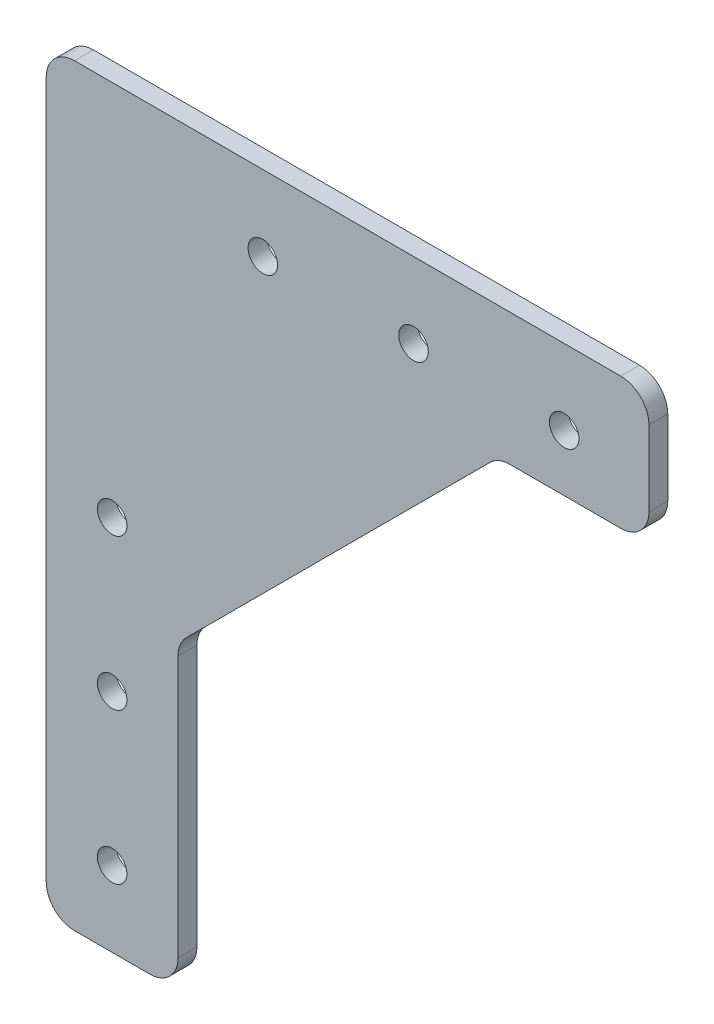
ISO-10303-21;
HEADER;
FILE_DESCRIPTION(('STEP AP214'),'2;1');
FILE_NAME('part.step','',(''),(''),'','','');
FILE_SCHEMA(('AUTOMOTIVE_DESIGN { 1 0 10303 214 1 1 1 1 }'));
ENDSEC;
DATA;
#1=APPLICATION_CONTEXT('core data for automotive mechanical design processes');
#2=APPLICATION_PROTOCOL_DEFINITION('international standard','automotive_design',2000,#1);
#3=PRODUCT_CONTEXT('',#1,'mechanical');
#4=PRODUCT('Part','Part','',(#3));
#5=PRODUCT_RELATED_PRODUCT_CATEGORY('part','',(#4));
#6=PRODUCT_DEFINITION_FORMATION('','',#4);
#7=PRODUCT_DEFINITION_CONTEXT('part definition',#1,'design');
#8=PRODUCT_DEFINITION('design','',#6,#7);
#9=PRODUCT_DEFINITION_SHAPE('','',#8);
#10=(LENGTH_UNIT() NAMED_UNIT(*) SI_UNIT(.MILLI.,.METRE.));
#11=(NAMED_UNIT(*) PLANE_ANGLE_UNIT() SI_UNIT($,.RADIAN.));
#12=(NAMED_UNIT(*) SI_UNIT($,.STERADIAN.) SOLID_ANGLE_UNIT());
#13=UNCERTAINTY_MEASURE_WITH_UNIT(LENGTH_MEASURE(1.E-05),#10,'distance_accuracy_value','');
#14=(GEOMETRIC_REPRESENTATION_CONTEXT(3) GLOBAL_UNCERTAINTY_ASSIGNED_CONTEXT((#13)) GLOBAL_UNIT_ASSIGNED_CONTEXT((#10,
#11,#12)) REPRESENTATION_CONTEXT('',''));
#15=CARTESIAN_POINT('',(0.,0.,0.));
#16=DIRECTION('',(0.,0.,1.));
#17=DIRECTION('',(1.,0.,0.));
#18=AXIS2_PLACEMENT_3D('',#15,#16,#17);
#19=CARTESIAN_POINT('',(0.,0.,1.5875));
#20=DIRECTION('',(0.,0.,-1.));
#21=DIRECTION('',(-1.,0.,0.));
#22=AXIS2_PLACEMENT_3D('',#19,#20,#21);
#23=PLANE('',#22);
#24=DIRECTION('',(0.,1.,0.));
#25=VECTOR('',#24,1.);
#26=CARTESIAN_POINT('',(0.,0.,1.5875));
#27=LINE('',#26,#25);
#28=CARTESIAN_POINT('',(0.,4.7625,1.5875));
#29=VERTEX_POINT('',#28);
#30=CARTESIAN_POINT('',(0.,122.2375,1.5875));
#31=VERTEX_POINT('',#30);
#32=EDGE_CURVE('E420',#29,#31,#27,.T.);
#33=ORIENTED_EDGE('',*,*,#32,.F.);
#34=CARTESIAN_POINT('',(4.7625,4.7625,1.5875));
#35=DIRECTION('',(0.,0.,-1.));
#36=DIRECTION('',(-1.,0.,0.));
#37=AXIS2_PLACEMENT_3D('',#34,#35,#36);
#38=CIRCLE('',#37,4.7625);
#39=CARTESIAN_POINT('',(4.7625,0.,1.5875));
#40=VERTEX_POINT('',#39);
#41=EDGE_CURVE('E337',#29,#40,#38,.F.);
#42=ORIENTED_EDGE('',*,*,#41,.T.);
#43=DIRECTION('',(-1.,0.,0.));
#44=VECTOR('',#43,1.);
#45=CARTESIAN_POINT('',(22.225,0.,1.5875));
#46=LINE('',#45,#44);
#47=CARTESIAN_POINT('',(17.4625,0.,1.5875));
#48=VERTEX_POINT('',#47);
#49=EDGE_CURVE('E374',#48,#40,#46,.T.);
#50=ORIENTED_EDGE('',*,*,#49,.F.);
#51=CARTESIAN_POINT('',(17.4625,4.7625,1.5875));
#52=DIRECTION('',(0.,0.,-1.));
#53=DIRECTION('',(-1.,0.,0.));
#54=AXIS2_PLACEMENT_3D('',#51,#52,#53);
#55=CIRCLE('',#54,4.7625);
#56=CARTESIAN_POINT('',(22.225,4.7625,1.5875));
#57=VERTEX_POINT('',#56);
#58=EDGE_CURVE('E310',#48,#57,#55,.F.);
#59=ORIENTED_EDGE('',*,*,#58,.T.);
#60=DIRECTION('',(0.,1.,0.));
#61=VECTOR('',#60,1.);
#62=CARTESIAN_POINT('',(22.225,0.,1.5875));
#63=LINE('',#62,#61);
#64=CARTESIAN_POINT('',(22.225,48.8273079091979,1.5875));
#65=VERTEX_POINT('',#64);
#66=EDGE_CURVE('E311',#57,#65,#63,.T.);
#67=ORIENTED_EDGE('',*,*,#66,.T.);
#68=CARTESIAN_POINT('',(26.9875,48.8273079091979,1.5875));
#69=DIRECTION('',(0.,0.,-1.));
#70=DIRECTION('',(-1.,0.,0.));
#71=AXIS2_PLACEMENT_3D('',#68,#69,#70);
#72=CIRCLE('',#71,4.7625);
#73=CARTESIAN_POINT('',(23.6199039545991,52.1949039545989,1.5875));
#74=VERTEX_POINT('',#73);
#75=EDGE_CURVE('E12',#65,#74,#72,.T.);
#76=ORIENTED_EDGE('',*,*,#75,.T.);
#77=DIRECTION('',(0.707106781186546,0.707106781186549,0.));
#78=VECTOR('',#77,1.);
#79=CARTESIAN_POINT('',(22.225,50.7999999999998,1.5875));
#80=LINE('',#79,#78);
#81=CARTESIAN_POINT('',(74.8050960454009,103.380096045401,1.5875));
#82=VERTEX_POINT('',#81);
#83=EDGE_CURVE('E315',#74,#82,#80,.T.);
#84=ORIENTED_EDGE('',*,*,#83,.T.);
#85=CARTESIAN_POINT('',(78.1726920908019,100.0125,1.5875));
#86=DIRECTION('',(0.,0.,-1.));
#87=DIRECTION('',(-1.,0.,0.));
#88=AXIS2_PLACEMENT_3D('',#85,#86,#87);
#89=CIRCLE('',#88,4.7625);
#90=CARTESIAN_POINT('',(78.1726920908019,104.775,1.5875));
#91=VERTEX_POINT('',#90);
#92=EDGE_CURVE('E364',#82,#91,#89,.T.);
#93=ORIENTED_EDGE('',*,*,#92,.T.);
#94=DIRECTION('',(1.,0.,0.));
#95=VECTOR('',#94,1.);
#96=CARTESIAN_POINT('',(76.2,104.775,1.5875));
#97=LINE('',#96,#95);
#98=CARTESIAN_POINT('',(96.8375,104.775,1.5875));
#99=VERTEX_POINT('',#98);
#100=EDGE_CURVE('E385',#91,#99,#97,.T.);
#101=ORIENTED_EDGE('',*,*,#100,.T.);
#102=CARTESIAN_POINT('',(96.8375,109.5375,1.5875));
#103=DIRECTION('',(0.,0.,-1.));
#104=DIRECTION('',(-1.,0.,0.));
#105=AXIS2_PLACEMENT_3D('',#102,#103,#104);
#106=CIRCLE('',#105,4.7625);
#107=CARTESIAN_POINT('',(101.6,109.5375,1.5875));
#108=VERTEX_POINT('',#107);
#109=EDGE_CURVE('E333',#99,#108,#106,.F.);
#110=ORIENTED_EDGE('',*,*,#109,.T.);
#111=DIRECTION('',(0.,-1.,0.));
#112=VECTOR('',#111,1.);
#113=CARTESIAN_POINT('',(101.6,127.,1.5875));
#114=LINE('',#113,#112);
#115=CARTESIAN_POINT('',(101.6,122.2375,1.5875));
#116=VERTEX_POINT('',#115);
#117=EDGE_CURVE('E388',#116,#108,#114,.T.);
#118=ORIENTED_EDGE('',*,*,#117,.F.);
#119=CARTESIAN_POINT('',(96.8375,122.2375,1.5875));
#120=DIRECTION('',(0.,0.,-1.));
#121=DIRECTION('',(-1.,0.,0.));
#122=AXIS2_PLACEMENT_3D('',#119,#120,#121);
#123=CIRCLE('',#122,4.7625);
#124=CARTESIAN_POINT('',(96.8375,127.,1.5875));
#125=VERTEX_POINT('',#124);
#126=EDGE_CURVE('E196',#116,#125,#123,.F.);
#127=ORIENTED_EDGE('',*,*,#126,.T.);
#128=DIRECTION('',(1.,0.,0.));
#129=VECTOR('',#128,1.);
#130=CARTESIAN_POINT('',(0.,127.,1.5875));
#131=LINE('',#130,#129);
#132=CARTESIAN_POINT('',(4.7625,127.,1.5875));
#133=VERTEX_POINT('',#132);
#134=EDGE_CURVE('E419',#133,#125,#131,.T.);
#135=ORIENTED_EDGE('',*,*,#134,.F.);
#136=CARTESIAN_POINT('',(4.7625,122.2375,1.5875));
#137=DIRECTION('',(0.,0.,-1.));
#138=DIRECTION('',(-1.,0.,0.));
#139=AXIS2_PLACEMENT_3D('',#136,#137,#138);
#140=CIRCLE('',#139,4.7625);
#141=EDGE_CURVE('E335',#133,#31,#140,.F.);
#142=ORIENTED_EDGE('',*,*,#141,.T.);
#143=EDGE_LOOP('',(#33,#42,#50,#59,#67,#76,#84,#93,#101,#110,#118,#127,#135,#142));
#144=FACE_BOUND('',#143,.T.);
#145=CARTESIAN_POINT('',(11.1124999999995,63.5,1.5875));
#146=DIRECTION('',(0.,0.,1.));
#147=DIRECTION('',(1.,0.,0.));
#148=AXIS2_PLACEMENT_3D('',#145,#146,#147);
#149=CIRCLE('',#148,2.48919999999999);
#150=CARTESIAN_POINT('',(13.6016999999995,63.5,1.5875));
#151=VERTEX_POINT('',#150);
#152=EDGE_CURVE('E306',#151,#151,#149,.T.);
#153=ORIENTED_EDGE('',*,*,#152,.F.);
#154=EDGE_LOOP('',(#153));
#155=FACE_BOUND('',#154,.T.);
#156=CARTESIAN_POINT('',(11.1125,12.7,1.5875));
#157=DIRECTION('',(0.,0.,1.));
#158=DIRECTION('',(1.,0.,0.));
#159=AXIS2_PLACEMENT_3D('',#156,#157,#158);
#160=CIRCLE('',#159,2.4892);
#161=CARTESIAN_POINT('',(13.6017,12.7,1.5875));
#162=VERTEX_POINT('',#161);
#163=EDGE_CURVE('E429',#162,#162,#160,.T.);
#164=ORIENTED_EDGE('',*,*,#163,.F.);
#165=EDGE_LOOP('',(#164));
#166=FACE_BOUND('',#165,.T.);
#167=CARTESIAN_POINT('',(87.3125,114.3,1.5875));
#168=DIRECTION('',(0.,0.,1.));
#169=DIRECTION('',(1.,0.,0.));
#170=AXIS2_PLACEMENT_3D('',#167,#168,#169);
#171=CIRCLE('',#170,2.48920000000001);
#172=CARTESIAN_POINT('',(89.8017,114.3,1.5875));
#173=VERTEX_POINT('',#172);
#174=EDGE_CURVE('E435',#173,#173,#171,.T.);
#175=ORIENTED_EDGE('',*,*,#174,.F.);
#176=EDGE_LOOP('',(#175));
#177=FACE_BOUND('',#176,.T.);
#178=CARTESIAN_POINT('',(11.1124999999997,38.1,1.5875));
#179=DIRECTION('',(0.,0.,1.));
#180=DIRECTION('',(1.,0.,0.));
#181=AXIS2_PLACEMENT_3D('',#178,#179,#180);
#182=CIRCLE('',#181,2.4892);
#183=CARTESIAN_POINT('',(13.6016999999997,38.1,1.5875));
#184=VERTEX_POINT('',#183);
#185=EDGE_CURVE('E441',#184,#184,#182,.T.);
#186=ORIENTED_EDGE('',*,*,#185,.F.);
#187=EDGE_LOOP('',(#186));
#188=FACE_BOUND('',#187,.T.);
#189=CARTESIAN_POINT('',(61.9125,114.3,1.5875));
#190=DIRECTION('',(0.,0.,1.));
#191=DIRECTION('',(1.,0.,0.));
#192=AXIS2_PLACEMENT_3D('',#189,#190,#191);
#193=CIRCLE('',#192,2.4892);
#194=CARTESIAN_POINT('',(64.4017,114.3,1.5875));
#195=VERTEX_POINT('',#194);
#196=EDGE_CURVE('E447',#195,#195,#193,.T.);
#197=ORIENTED_EDGE('',*,*,#196,.F.);
#198=EDGE_LOOP('',(#197));
#199=FACE_BOUND('',#198,.T.);
#200=CARTESIAN_POINT('',(36.5125,114.3,1.5875));
#201=DIRECTION('',(0.,0.,1.));
#202=DIRECTION('',(1.,0.,0.));
#203=AXIS2_PLACEMENT_3D('',#200,#201,#202);
#204=CIRCLE('',#203,2.4892);
#205=CARTESIAN_POINT('',(39.0017,114.3,1.5875));
#206=VERTEX_POINT('',#205);
#207=EDGE_CURVE('E453',#206,#206,#204,.T.);
#208=ORIENTED_EDGE('',*,*,#207,.F.);
#209=EDGE_LOOP('',(#208));
#210=FACE_BOUND('',#209,.T.);
#211=ADVANCED_FACE('F181',(#144,#155,#166,#177,#188,#199,#210),#23,.F.);
#212=CARTESIAN_POINT('',(0.,0.,-1.5875));
#213=DIRECTION('',(0.,0.,-1.));
#214=DIRECTION('',(-1.,0.,0.));
#215=AXIS2_PLACEMENT_3D('',#212,#213,#214);
#216=PLANE('',#215);
#217=CARTESIAN_POINT('',(61.9125,114.3,-1.5875));
#218=DIRECTION('',(0.,0.,1.));
#219=DIRECTION('',(1.,0.,0.));
#220=AXIS2_PLACEMENT_3D('',#217,#218,#219);
#221=CIRCLE('',#220,2.4892);
#222=CARTESIAN_POINT('',(64.4017,114.3,-1.5875));
#223=VERTEX_POINT('',#222);
#224=EDGE_CURVE('E450',#223,#223,#221,.T.);
#225=ORIENTED_EDGE('',*,*,#224,.T.);
#226=EDGE_LOOP('',(#225));
#227=FACE_BOUND('',#226,.T.);
#228=CARTESIAN_POINT('',(87.3125,114.3,-1.5875));
#229=DIRECTION('',(0.,0.,1.));
#230=DIRECTION('',(1.,0.,0.));
#231=AXIS2_PLACEMENT_3D('',#228,#229,#230);
#232=CIRCLE('',#231,2.48920000000001);
#233=CARTESIAN_POINT('',(89.8017,114.3,-1.5875));
#234=VERTEX_POINT('',#233);
#235=EDGE_CURVE('E438',#234,#234,#232,.T.);
#236=ORIENTED_EDGE('',*,*,#235,.T.);
#237=EDGE_LOOP('',(#236));
#238=FACE_BOUND('',#237,.T.);
#239=CARTESIAN_POINT('',(11.1124999999995,63.5,-1.5875));
#240=DIRECTION('',(0.,0.,1.));
#241=DIRECTION('',(1.,0.,0.));
#242=AXIS2_PLACEMENT_3D('',#239,#240,#241);
#243=CIRCLE('',#242,2.48919999999999);
#244=CARTESIAN_POINT('',(13.6016999999995,63.5,-1.5875));
#245=VERTEX_POINT('',#244);
#246=EDGE_CURVE('E426',#245,#245,#243,.T.);
#247=ORIENTED_EDGE('',*,*,#246,.T.);
#248=EDGE_LOOP('',(#247));
#249=FACE_BOUND('',#248,.T.);
#250=DIRECTION('',(-1.,0.,0.));
#251=VECTOR('',#250,1.);
#252=CARTESIAN_POINT('',(22.225,0.,-1.5875));
#253=LINE('',#252,#251);
#254=CARTESIAN_POINT('',(17.4625,0.,-1.5875));
#255=VERTEX_POINT('',#254);
#256=CARTESIAN_POINT('',(4.7625,0.,-1.5875));
#257=VERTEX_POINT('',#256);
#258=EDGE_CURVE('E287',#255,#257,#253,.T.);
#259=ORIENTED_EDGE('',*,*,#258,.T.);
#260=CARTESIAN_POINT('',(4.7625,4.7625,-1.5875));
#261=DIRECTION('',(0.,0.,-1.));
#262=DIRECTION('',(-1.,0.,0.));
#263=AXIS2_PLACEMENT_3D('',#260,#261,#262);
#264=CIRCLE('',#263,4.7625);
#265=CARTESIAN_POINT('',(0.,4.7625,-1.5875));
#266=VERTEX_POINT('',#265);
#267=EDGE_CURVE('E324',#257,#266,#264,.T.);
#268=ORIENTED_EDGE('',*,*,#267,.T.);
#269=DIRECTION('',(0.,1.,0.));
#270=VECTOR('',#269,1.);
#271=CARTESIAN_POINT('',(0.,0.,-1.5875));
#272=LINE('',#271,#270);
#273=CARTESIAN_POINT('',(0.,122.2375,-1.5875));
#274=VERTEX_POINT('',#273);
#275=EDGE_CURVE('E305',#266,#274,#272,.T.);
#276=ORIENTED_EDGE('',*,*,#275,.T.);
#277=CARTESIAN_POINT('',(4.7625,122.2375,-1.5875));
#278=DIRECTION('',(0.,0.,-1.));
#279=DIRECTION('',(-1.,0.,0.));
#280=AXIS2_PLACEMENT_3D('',#277,#278,#279);
#281=CIRCLE('',#280,4.7625);
#282=CARTESIAN_POINT('',(4.7625,127.,-1.5875));
#283=VERTEX_POINT('',#282);
#284=EDGE_CURVE('E322',#274,#283,#281,.T.);
#285=ORIENTED_EDGE('',*,*,#284,.T.);
#286=DIRECTION('',(1.,0.,0.));
#287=VECTOR('',#286,1.);
#288=CARTESIAN_POINT('',(0.,127.,-1.5875));
#289=LINE('',#288,#287);
#290=CARTESIAN_POINT('',(96.8375,127.,-1.5875));
#291=VERTEX_POINT('',#290);
#292=EDGE_CURVE('E394',#283,#291,#289,.T.);
#293=ORIENTED_EDGE('',*,*,#292,.T.);
#294=CARTESIAN_POINT('',(96.8375,122.2375,-1.5875));
#295=DIRECTION('',(0.,0.,-1.));
#296=DIRECTION('',(-1.,0.,0.));
#297=AXIS2_PLACEMENT_3D('',#294,#295,#296);
#298=CIRCLE('',#297,4.7625);
#299=CARTESIAN_POINT('',(101.6,122.2375,-1.5875));
#300=VERTEX_POINT('',#299);
#301=EDGE_CURVE('E295',#291,#300,#298,.T.);
#302=ORIENTED_EDGE('',*,*,#301,.T.);
#303=DIRECTION('',(0.,-1.,0.));
#304=VECTOR('',#303,1.);
#305=CARTESIAN_POINT('',(101.6,127.,-1.5875));
#306=LINE('',#305,#304);
#307=CARTESIAN_POINT('',(101.6,109.5375,-1.5875));
#308=VERTEX_POINT('',#307);
#309=EDGE_CURVE('E397',#300,#308,#306,.T.);
#310=ORIENTED_EDGE('',*,*,#309,.T.);
#311=CARTESIAN_POINT('',(96.8375,109.5375,-1.5875));
#312=DIRECTION('',(0.,0.,-1.));
#313=DIRECTION('',(-1.,0.,0.));
#314=AXIS2_PLACEMENT_3D('',#311,#312,#313);
#315=CIRCLE('',#314,4.7625);
#316=CARTESIAN_POINT('',(96.8375,104.775,-1.5875));
#317=VERTEX_POINT('',#316);
#318=EDGE_CURVE('E294',#308,#317,#315,.T.);
#319=ORIENTED_EDGE('',*,*,#318,.T.);
#320=DIRECTION('',(1.,0.,0.));
#321=VECTOR('',#320,1.);
#322=CARTESIAN_POINT('',(76.2,104.775,-1.5875));
#323=LINE('',#322,#321);
#324=CARTESIAN_POINT('',(78.1726920908019,104.775,-1.5875));
#325=VERTEX_POINT('',#324);
#326=EDGE_CURVE('E400',#325,#317,#323,.T.);
#327=ORIENTED_EDGE('',*,*,#326,.F.);
#328=CARTESIAN_POINT('',(78.1726920908019,100.0125,-1.5875));
#329=DIRECTION('',(0.,0.,-1.));
#330=DIRECTION('',(-1.,0.,0.));
#331=AXIS2_PLACEMENT_3D('',#328,#329,#330);
#332=CIRCLE('',#331,4.7625);
#333=CARTESIAN_POINT('',(74.8050960454009,103.380096045401,-1.5875));
#334=VERTEX_POINT('',#333);
#335=EDGE_CURVE('E362',#325,#334,#332,.F.);
#336=ORIENTED_EDGE('',*,*,#335,.T.);
#337=DIRECTION('',(0.707106781186546,0.707106781186549,0.));
#338=VECTOR('',#337,1.);
#339=CARTESIAN_POINT('',(22.225,50.7999999999998,-1.5875));
#340=LINE('',#339,#338);
#341=CARTESIAN_POINT('',(23.6199039545991,52.1949039545989,-1.5875));
#342=VERTEX_POINT('',#341);
#343=EDGE_CURVE('E367',#342,#334,#340,.T.);
#344=ORIENTED_EDGE('',*,*,#343,.F.);
#345=CARTESIAN_POINT('',(26.9875,48.8273079091979,-1.5875));
#346=DIRECTION('',(0.,0.,-1.));
#347=DIRECTION('',(-1.,0.,0.));
#348=AXIS2_PLACEMENT_3D('',#345,#346,#347);
#349=CIRCLE('',#348,4.7625);
#350=CARTESIAN_POINT('',(22.225,48.8273079091979,-1.5875));
#351=VERTEX_POINT('',#350);
#352=EDGE_CURVE('E189',#342,#351,#349,.F.);
#353=ORIENTED_EDGE('',*,*,#352,.T.);
#354=DIRECTION('',(0.,1.,0.));
#355=VECTOR('',#354,1.);
#356=CARTESIAN_POINT('',(22.225,0.,-1.5875));
#357=LINE('',#356,#355);
#358=CARTESIAN_POINT('',(22.225,4.7625,-1.5875));
#359=VERTEX_POINT('',#358);
#360=EDGE_CURVE('E289',#359,#351,#357,.T.);
#361=ORIENTED_EDGE('',*,*,#360,.F.);
#362=CARTESIAN_POINT('',(17.4625,4.7625,-1.5875));
#363=DIRECTION('',(0.,0.,-1.));
#364=DIRECTION('',(-1.,0.,0.));
#365=AXIS2_PLACEMENT_3D('',#362,#363,#364);
#366=CIRCLE('',#365,4.7625);
#367=EDGE_CURVE('E283',#359,#255,#366,.T.);
#368=ORIENTED_EDGE('',*,*,#367,.T.);
#369=EDGE_LOOP('',(#259,#268,#276,#285,#293,#302,#310,#319,#327,#336,#344,#353,#361,#368));
#370=FACE_BOUND('',#369,.T.);
#371=CARTESIAN_POINT('',(11.1125,12.7,-1.5875));
#372=DIRECTION('',(0.,0.,1.));
#373=DIRECTION('',(1.,0.,0.));
#374=AXIS2_PLACEMENT_3D('',#371,#372,#373);
#375=CIRCLE('',#374,2.4892);
#376=CARTESIAN_POINT('',(13.6017,12.7,-1.5875));
#377=VERTEX_POINT('',#376);
#378=EDGE_CURVE('E432',#377,#377,#375,.T.);
#379=ORIENTED_EDGE('',*,*,#378,.T.);
#380=EDGE_LOOP('',(#379));
#381=FACE_BOUND('',#380,.T.);
#382=CARTESIAN_POINT('',(11.1124999999997,38.1,-1.5875));
#383=DIRECTION('',(0.,0.,1.));
#384=DIRECTION('',(1.,0.,0.));
#385=AXIS2_PLACEMENT_3D('',#382,#383,#384);
#386=CIRCLE('',#385,2.4892);
#387=CARTESIAN_POINT('',(13.6016999999997,38.1,-1.5875));
#388=VERTEX_POINT('',#387);
#389=EDGE_CURVE('E444',#388,#388,#386,.T.);
#390=ORIENTED_EDGE('',*,*,#389,.T.);
#391=EDGE_LOOP('',(#390));
#392=FACE_BOUND('',#391,.T.);
#393=CARTESIAN_POINT('',(36.5125,114.3,-1.5875));
#394=DIRECTION('',(0.,0.,1.));
#395=DIRECTION('',(1.,0.,0.));
#396=AXIS2_PLACEMENT_3D('',#393,#394,#395);
#397=CIRCLE('',#396,2.4892);
#398=CARTESIAN_POINT('',(39.0017,114.3,-1.5875));
#399=VERTEX_POINT('',#398);
#400=EDGE_CURVE('E456',#399,#399,#397,.T.);
#401=ORIENTED_EDGE('',*,*,#400,.T.);
#402=EDGE_LOOP('',(#401));
#403=FACE_BOUND('',#402,.T.);
#404=ADVANCED_FACE('F285',(#227,#238,#249,#370,#381,#392,#403),#216,.T.);
#405=CARTESIAN_POINT('',(22.225,0.,1.5875));
#406=DIRECTION('',(0.,-1.,0.));
#407=DIRECTION('',(0.,0.,-1.));
#408=AXIS2_PLACEMENT_3D('',#405,#406,#407);
#409=PLANE('',#408);
#410=ORIENTED_EDGE('',*,*,#49,.T.);
#411=DIRECTION('',(0.,0.,-1.));
#412=VECTOR('',#411,1.);
#413=CARTESIAN_POINT('',(4.7625,0.,1.5875));
#414=LINE('',#413,#412);
#415=EDGE_CURVE('E304',#40,#257,#414,.T.);
#416=ORIENTED_EDGE('',*,*,#415,.T.);
#417=ORIENTED_EDGE('',*,*,#258,.F.);
#418=DIRECTION('',(0.,0.,-1.));
#419=VECTOR('',#418,1.);
#420=CARTESIAN_POINT('',(17.4625,0.,1.5875));
#421=LINE('',#420,#419);
#422=EDGE_CURVE('E301',#255,#48,#421,.F.);
#423=ORIENTED_EDGE('',*,*,#422,.T.);
#424=EDGE_LOOP('',(#410,#416,#417,#423));
#425=FACE_BOUND('',#424,.T.);
#426=ADVANCED_FACE('F300',(#425),#409,.T.);
#427=CARTESIAN_POINT('',(22.225,0.,1.5875));
#428=DIRECTION('',(-1.,0.,0.));
#429=DIRECTION('',(0.,0.,1.));
#430=AXIS2_PLACEMENT_3D('',#427,#428,#429);
#431=PLANE('',#430);
#432=ORIENTED_EDGE('',*,*,#360,.T.);
#433=DIRECTION('',(0.,0.,-1.));
#434=VECTOR('',#433,1.);
#435=CARTESIAN_POINT('',(22.225,48.8273079091979,1.5875));
#436=LINE('',#435,#434);
#437=EDGE_CURVE('E360',#351,#65,#436,.F.);
#438=ORIENTED_EDGE('',*,*,#437,.T.);
#439=ORIENTED_EDGE('',*,*,#66,.F.);
#440=DIRECTION('',(0.,0.,-1.));
#441=VECTOR('',#440,1.);
#442=CARTESIAN_POINT('',(22.225,4.7625,-1.5875));
#443=LINE('',#442,#441);
#444=EDGE_CURVE('E358',#57,#359,#443,.T.);
#445=ORIENTED_EDGE('',*,*,#444,.T.);
#446=EDGE_LOOP('',(#432,#438,#439,#445));
#447=FACE_BOUND('',#446,.T.);
#448=ADVANCED_FACE('F372',(#447),#431,.F.);
#449=CARTESIAN_POINT('',(22.225,50.7999999999998,1.5875));
#450=DIRECTION('',(-0.707106781186549,0.707106781186546,0.));
#451=DIRECTION('',(-0.707106781186546,-0.707106781186549,0.));
#452=AXIS2_PLACEMENT_3D('',#449,#450,#451);
#453=PLANE('',#452);
#454=ORIENTED_EDGE('',*,*,#343,.T.);
#455=DIRECTION('',(0.,0.,-1.));
#456=VECTOR('',#455,1.);
#457=CARTESIAN_POINT('',(74.8050960454009,103.380096045401,1.5875));
#458=LINE('',#457,#456);
#459=EDGE_CURVE('E356',#334,#82,#458,.F.);
#460=ORIENTED_EDGE('',*,*,#459,.T.);
#461=ORIENTED_EDGE('',*,*,#83,.F.);
#462=DIRECTION('',(0.,0.,-1.));
#463=VECTOR('',#462,1.);
#464=CARTESIAN_POINT('',(23.6199039545991,52.1949039545989,-1.5875));
#465=LINE('',#464,#463);
#466=EDGE_CURVE('E353',#74,#342,#465,.T.);
#467=ORIENTED_EDGE('',*,*,#466,.T.);
#468=EDGE_LOOP('',(#454,#460,#461,#467));
#469=FACE_BOUND('',#468,.T.);
#470=ADVANCED_FACE('F383',(#469),#453,.F.);
#471=CARTESIAN_POINT('',(76.2,104.775,1.5875));
#472=DIRECTION('',(0.,1.,0.));
#473=DIRECTION('',(0.,0.,1.));
#474=AXIS2_PLACEMENT_3D('',#471,#472,#473);
#475=PLANE('',#474);
#476=ORIENTED_EDGE('',*,*,#326,.T.);
#477=DIRECTION('',(0.,0.,-1.));
#478=VECTOR('',#477,1.);
#479=CARTESIAN_POINT('',(96.8375,104.775,1.5875));
#480=LINE('',#479,#478);
#481=EDGE_CURVE('E351',#317,#99,#480,.F.);
#482=ORIENTED_EDGE('',*,*,#481,.T.);
#483=ORIENTED_EDGE('',*,*,#100,.F.);
#484=DIRECTION('',(0.,0.,-1.));
#485=VECTOR('',#484,1.);
#486=CARTESIAN_POINT('',(78.1726920908019,104.775,-1.5875));
#487=LINE('',#486,#485);
#488=EDGE_CURVE('E348',#91,#325,#487,.T.);
#489=ORIENTED_EDGE('',*,*,#488,.T.);
#490=EDGE_LOOP('',(#476,#482,#483,#489));
#491=FACE_BOUND('',#490,.T.);
#492=ADVANCED_FACE('F408',(#491),#475,.F.);
#493=CARTESIAN_POINT('',(101.6,127.,1.5875));
#494=DIRECTION('',(1.,0.,0.));
#495=DIRECTION('',(0.,0.,-1.));
#496=AXIS2_PLACEMENT_3D('',#493,#494,#495);
#497=PLANE('',#496);
#498=ORIENTED_EDGE('',*,*,#117,.T.);
#499=DIRECTION('',(0.,0.,-1.));
#500=VECTOR('',#499,1.);
#501=CARTESIAN_POINT('',(101.6,109.5375,-1.5875));
#502=LINE('',#501,#500);
#503=EDGE_CURVE('E345',#108,#308,#502,.T.);
#504=ORIENTED_EDGE('',*,*,#503,.T.);
#505=ORIENTED_EDGE('',*,*,#309,.F.);
#506=DIRECTION('',(0.,0.,-1.));
#507=VECTOR('',#506,1.);
#508=CARTESIAN_POINT('',(101.6,122.2375,1.5875));
#509=LINE('',#508,#507);
#510=EDGE_CURVE('E343',#300,#116,#509,.F.);
#511=ORIENTED_EDGE('',*,*,#510,.T.);
#512=EDGE_LOOP('',(#498,#504,#505,#511));
#513=FACE_BOUND('',#512,.T.);
#514=ADVANCED_FACE('F416',(#513),#497,.T.);
#515=CARTESIAN_POINT('',(0.,127.,1.5875));
#516=DIRECTION('',(0.,1.,0.));
#517=DIRECTION('',(0.,0.,1.));
#518=AXIS2_PLACEMENT_3D('',#515,#516,#517);
#519=PLANE('',#518);
#520=ORIENTED_EDGE('',*,*,#292,.F.);
#521=DIRECTION('',(0.,0.,-1.));
#522=VECTOR('',#521,1.);
#523=CARTESIAN_POINT('',(4.7625,127.,1.5875));
#524=LINE('',#523,#522);
#525=EDGE_CURVE('E203',#283,#133,#524,.F.);
#526=ORIENTED_EDGE('',*,*,#525,.T.);
#527=ORIENTED_EDGE('',*,*,#134,.T.);
#528=DIRECTION('',(0.,0.,-1.));
#529=VECTOR('',#528,1.);
#530=CARTESIAN_POINT('',(96.8375,127.,1.5875));
#531=LINE('',#530,#529);
#532=EDGE_CURVE('E339',#125,#291,#531,.T.);
#533=ORIENTED_EDGE('',*,*,#532,.T.);
#534=EDGE_LOOP('',(#520,#526,#527,#533));
#535=FACE_BOUND('',#534,.T.);
#536=ADVANCED_FACE('F484',(#535),#519,.T.);
#537=CARTESIAN_POINT('',(0.,0.,1.5875));
#538=DIRECTION('',(-1.,0.,0.));
#539=DIRECTION('',(0.,0.,1.));
#540=AXIS2_PLACEMENT_3D('',#537,#538,#539);
#541=PLANE('',#540);
#542=ORIENTED_EDGE('',*,*,#275,.F.);
#543=DIRECTION('',(0.,0.,-1.));
#544=VECTOR('',#543,1.);
#545=CARTESIAN_POINT('',(0.,4.7625,1.5875));
#546=LINE('',#545,#544);
#547=EDGE_CURVE('E329',#266,#29,#546,.F.);
#548=ORIENTED_EDGE('',*,*,#547,.T.);
#549=ORIENTED_EDGE('',*,*,#32,.T.);
#550=DIRECTION('',(0.,0.,-1.));
#551=VECTOR('',#550,1.);
#552=CARTESIAN_POINT('',(0.,122.2375,1.5875));
#553=LINE('',#552,#551);
#554=EDGE_CURVE('E326',#31,#274,#553,.T.);
#555=ORIENTED_EDGE('',*,*,#554,.T.);
#556=EDGE_LOOP('',(#542,#548,#549,#555));
#557=FACE_BOUND('',#556,.T.);
#558=ADVANCED_FACE('F487',(#557),#541,.T.);
#559=CARTESIAN_POINT('',(11.1124999999995,63.5,1.5875));
#560=DIRECTION('',(0.,0.,-1.));
#561=DIRECTION('',(-1.,0.,0.));
#562=AXIS2_PLACEMENT_3D('',#559,#560,#561);
#563=CYLINDRICAL_SURFACE('',#562,2.48919999999999);
#564=ORIENTED_EDGE('',*,*,#152,.T.);
#565=EDGE_LOOP('',(#564));
#566=FACE_BOUND('',#565,.T.);
#567=ORIENTED_EDGE('',*,*,#246,.F.);
#568=EDGE_LOOP('',(#567));
#569=FACE_BOUND('',#568,.T.);
#570=ADVANCED_FACE('F473',(#566,#569),#563,.F.);
#571=CARTESIAN_POINT('',(11.1125,12.7,1.5875));
#572=DIRECTION('',(0.,0.,-1.));
#573=DIRECTION('',(-1.,0.,0.));
#574=AXIS2_PLACEMENT_3D('',#571,#572,#573);
#575=CYLINDRICAL_SURFACE('',#574,2.4892);
#576=ORIENTED_EDGE('',*,*,#163,.T.);
#577=EDGE_LOOP('',(#576));
#578=FACE_BOUND('',#577,.T.);
#579=ORIENTED_EDGE('',*,*,#378,.F.);
#580=EDGE_LOOP('',(#579));
#581=FACE_BOUND('',#580,.T.);
#582=ADVANCED_FACE('F665',(#578,#581),#575,.F.);
#583=CARTESIAN_POINT('',(87.3125,114.3,1.5875));
#584=DIRECTION('',(0.,0.,-1.));
#585=DIRECTION('',(-1.,0.,0.));
#586=AXIS2_PLACEMENT_3D('',#583,#584,#585);
#587=CYLINDRICAL_SURFACE('',#586,2.48920000000001);
#588=ORIENTED_EDGE('',*,*,#174,.T.);
#589=EDGE_LOOP('',(#588));
#590=FACE_BOUND('',#589,.T.);
#591=ORIENTED_EDGE('',*,*,#235,.F.);
#592=EDGE_LOOP('',(#591));
#593=FACE_BOUND('',#592,.T.);
#594=ADVANCED_FACE('F654',(#590,#593),#587,.F.);
#595=CARTESIAN_POINT('',(11.1124999999997,38.1,1.5875));
#596=DIRECTION('',(0.,0.,-1.));
#597=DIRECTION('',(-1.,0.,0.));
#598=AXIS2_PLACEMENT_3D('',#595,#596,#597);
#599=CYLINDRICAL_SURFACE('',#598,2.4892);
#600=ORIENTED_EDGE('',*,*,#185,.T.);
#601=EDGE_LOOP('',(#600));
#602=FACE_BOUND('',#601,.T.);
#603=ORIENTED_EDGE('',*,*,#389,.F.);
#604=EDGE_LOOP('',(#603));
#605=FACE_BOUND('',#604,.T.);
#606=ADVANCED_FACE('F643',(#602,#605),#599,.F.);
#607=CARTESIAN_POINT('',(61.9125,114.3,1.5875));
#608=DIRECTION('',(0.,0.,-1.));
#609=DIRECTION('',(-1.,0.,0.));
#610=AXIS2_PLACEMENT_3D('',#607,#608,#609);
#611=CYLINDRICAL_SURFACE('',#610,2.4892);
#612=ORIENTED_EDGE('',*,*,#196,.T.);
#613=EDGE_LOOP('',(#612));
#614=FACE_BOUND('',#613,.T.);
#615=ORIENTED_EDGE('',*,*,#224,.F.);
#616=EDGE_LOOP('',(#615));
#617=FACE_BOUND('',#616,.T.);
#618=ADVANCED_FACE('F633',(#614,#617),#611,.F.);
#619=CARTESIAN_POINT('',(36.5125,114.3,1.5875));
#620=DIRECTION('',(0.,0.,-1.));
#621=DIRECTION('',(-1.,0.,0.));
#622=AXIS2_PLACEMENT_3D('',#619,#620,#621);
#623=CYLINDRICAL_SURFACE('',#622,2.4892);
#624=ORIENTED_EDGE('',*,*,#207,.T.);
#625=EDGE_LOOP('',(#624));
#626=FACE_BOUND('',#625,.T.);
#627=ORIENTED_EDGE('',*,*,#400,.F.);
#628=EDGE_LOOP('',(#627));
#629=FACE_BOUND('',#628,.T.);
#630=ADVANCED_FACE('F462',(#626,#629),#623,.F.);
#631=CARTESIAN_POINT('',(4.7625,4.7625,1.5875));
#632=DIRECTION('',(0.,0.,-1.));
#633=DIRECTION('',(-1.,0.,0.));
#634=AXIS2_PLACEMENT_3D('',#631,#632,#633);
#635=CYLINDRICAL_SURFACE('',#634,4.7625);
#636=ORIENTED_EDGE('',*,*,#41,.F.);
#637=ORIENTED_EDGE('',*,*,#547,.F.);
#638=ORIENTED_EDGE('',*,*,#267,.F.);
#639=ORIENTED_EDGE('',*,*,#415,.F.);
#640=EDGE_LOOP('',(#636,#637,#638,#639));
#641=FACE_BOUND('',#640,.T.);
#642=ADVANCED_FACE('F493',(#641),#635,.T.);
#643=CARTESIAN_POINT('',(4.7625,122.2375,1.5875));
#644=DIRECTION('',(0.,0.,-1.));
#645=DIRECTION('',(-1.,0.,0.));
#646=AXIS2_PLACEMENT_3D('',#643,#644,#645);
#647=CYLINDRICAL_SURFACE('',#646,4.7625);
#648=ORIENTED_EDGE('',*,*,#141,.F.);
#649=ORIENTED_EDGE('',*,*,#525,.F.);
#650=ORIENTED_EDGE('',*,*,#284,.F.);
#651=ORIENTED_EDGE('',*,*,#554,.F.);
#652=EDGE_LOOP('',(#648,#649,#650,#651));
#653=FACE_BOUND('',#652,.T.);
#654=ADVANCED_FACE('F496',(#653),#647,.T.);
#655=CARTESIAN_POINT('',(96.8375,109.5375,1.5875));
#656=DIRECTION('',(0.,0.,1.));
#657=DIRECTION('',(1.,0.,0.));
#658=AXIS2_PLACEMENT_3D('',#655,#656,#657);
#659=CYLINDRICAL_SURFACE('',#658,4.7625);
#660=ORIENTED_EDGE('',*,*,#109,.F.);
#661=ORIENTED_EDGE('',*,*,#481,.F.);
#662=ORIENTED_EDGE('',*,*,#318,.F.);
#663=ORIENTED_EDGE('',*,*,#503,.F.);
#664=EDGE_LOOP('',(#660,#661,#662,#663));
#665=FACE_BOUND('',#664,.T.);
#666=ADVANCED_FACE('F412',(#665),#659,.T.);
#667=CARTESIAN_POINT('',(78.1726920908019,100.0125,1.5875));
#668=DIRECTION('',(0.,0.,1.));
#669=DIRECTION('',(1.,0.,0.));
#670=AXIS2_PLACEMENT_3D('',#667,#668,#669);
#671=CYLINDRICAL_SURFACE('',#670,4.7625);
#672=ORIENTED_EDGE('',*,*,#92,.F.);
#673=ORIENTED_EDGE('',*,*,#459,.F.);
#674=ORIENTED_EDGE('',*,*,#335,.F.);
#675=ORIENTED_EDGE('',*,*,#488,.F.);
#676=EDGE_LOOP('',(#672,#673,#674,#675));
#677=FACE_BOUND('',#676,.T.);
#678=ADVANCED_FACE('F403',(#677),#671,.F.);
#679=CARTESIAN_POINT('',(26.9875,48.8273079091979,1.5875));
#680=DIRECTION('',(0.,0.,1.));
#681=DIRECTION('',(1.,0.,0.));
#682=AXIS2_PLACEMENT_3D('',#679,#680,#681);
#683=CYLINDRICAL_SURFACE('',#682,4.7625);
#684=ORIENTED_EDGE('',*,*,#75,.F.);
#685=ORIENTED_EDGE('',*,*,#437,.F.);
#686=ORIENTED_EDGE('',*,*,#352,.F.);
#687=ORIENTED_EDGE('',*,*,#466,.F.);
#688=EDGE_LOOP('',(#684,#685,#686,#687));
#689=FACE_BOUND('',#688,.T.);
#690=ADVANCED_FACE('F376',(#689),#683,.F.);
#691=CARTESIAN_POINT('',(17.4625,4.7625,1.5875));
#692=DIRECTION('',(0.,0.,1.));
#693=DIRECTION('',(1.,0.,0.));
#694=AXIS2_PLACEMENT_3D('',#691,#692,#693);
#695=CYLINDRICAL_SURFACE('',#694,4.7625);
#696=ORIENTED_EDGE('',*,*,#58,.F.);
#697=ORIENTED_EDGE('',*,*,#422,.F.);
#698=ORIENTED_EDGE('',*,*,#367,.F.);
#699=ORIENTED_EDGE('',*,*,#444,.F.);
#700=EDGE_LOOP('',(#696,#697,#698,#699));
#701=FACE_BOUND('',#700,.T.);
#702=ADVANCED_FACE('F309',(#701),#695,.T.);
#703=CARTESIAN_POINT('',(96.8375,122.2375,1.5875));
#704=DIRECTION('',(0.,0.,-1.));
#705=DIRECTION('',(-1.,0.,0.));
#706=AXIS2_PLACEMENT_3D('',#703,#704,#705);
#707=CYLINDRICAL_SURFACE('',#706,4.7625);
#708=ORIENTED_EDGE('',*,*,#126,.F.);
#709=ORIENTED_EDGE('',*,*,#510,.F.);
#710=ORIENTED_EDGE('',*,*,#301,.F.);
#711=ORIENTED_EDGE('',*,*,#532,.F.);
#712=EDGE_LOOP('',(#708,#709,#710,#711));
#713=FACE_BOUND('',#712,.T.);
#714=ADVANCED_FACE('F183',(#713),#707,.T.);
#715=CLOSED_SHELL('',(#211,#404,#426,#448,#470,#492,#514,#536,#558,#570,#582,#594,#606,#618,
#630,#642,#654,#666,#678,#690,#702,#714));
#716=MANIFOLD_SOLID_BREP('B2',#715);
#717=ADVANCED_BREP_SHAPE_REPRESENTATION('',(#18,#716),#14);
#718=SHAPE_DEFINITION_REPRESENTATION(#9,#717);
ENDSEC;
END-ISO-10303-21;
